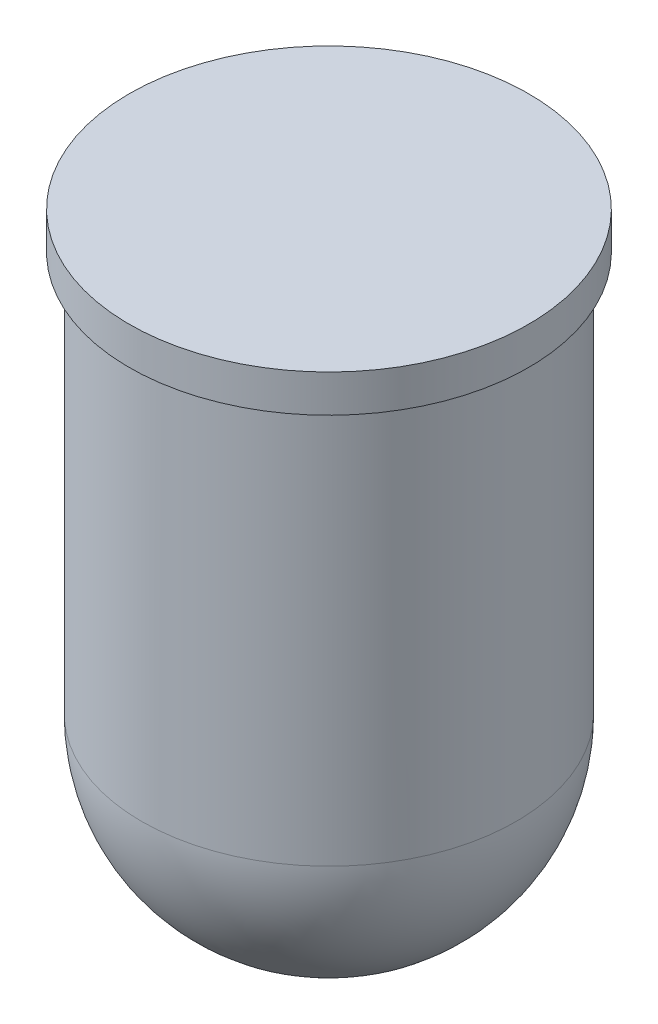
ISO-10303-21;
HEADER;
FILE_DESCRIPTION(('STEP AP214'),'2;1');
FILE_NAME('part.step','',(''),(''),'','','');
FILE_SCHEMA(('AUTOMOTIVE_DESIGN { 1 0 10303 214 1 1 1 1 }'));
ENDSEC;
DATA;
#1=APPLICATION_CONTEXT('core data for automotive mechanical design processes');
#2=APPLICATION_PROTOCOL_DEFINITION('international standard','automotive_design',2000,#1);
#3=PRODUCT_CONTEXT('',#1,'mechanical');
#4=PRODUCT('Part','Part','',(#3));
#5=PRODUCT_RELATED_PRODUCT_CATEGORY('part','',(#4));
#6=PRODUCT_DEFINITION_FORMATION('','',#4);
#7=PRODUCT_DEFINITION_CONTEXT('part definition',#1,'design');
#8=PRODUCT_DEFINITION('design','',#6,#7);
#9=PRODUCT_DEFINITION_SHAPE('','',#8);
#10=(LENGTH_UNIT() NAMED_UNIT(*) SI_UNIT(.MILLI.,.METRE.));
#11=(NAMED_UNIT(*) PLANE_ANGLE_UNIT() SI_UNIT($,.RADIAN.));
#12=(NAMED_UNIT(*) SI_UNIT($,.STERADIAN.) SOLID_ANGLE_UNIT());
#13=UNCERTAINTY_MEASURE_WITH_UNIT(LENGTH_MEASURE(1.E-05),#10,'distance_accuracy_value','');
#14=(GEOMETRIC_REPRESENTATION_CONTEXT(3) GLOBAL_UNCERTAINTY_ASSIGNED_CONTEXT((#13)) GLOBAL_UNIT_ASSIGNED_CONTEXT((#10,
#11,#12)) REPRESENTATION_CONTEXT('',''));
#15=CARTESIAN_POINT('',(0.,0.,0.));
#16=DIRECTION('',(0.,0.,1.));
#17=DIRECTION('',(1.,0.,0.));
#18=AXIS2_PLACEMENT_3D('',#15,#16,#17);
#19=CARTESIAN_POINT('',(60.,5.,0.));
#20=DIRECTION('',(0.,1.,0.));
#21=DIRECTION('',(0.,0.,-1.));
#22=AXIS2_PLACEMENT_3D('',#19,#20,#21);
#23=PLANE('',#22);
#24=CARTESIAN_POINT('',(60.,5.,0.));
#25=DIRECTION('',(0.,1.,0.));
#26=DIRECTION('',(1.,0.,0.));
#27=AXIS2_PLACEMENT_3D('',#24,#25,#26);
#28=CIRCLE('',#27,1.6);
#29=CARTESIAN_POINT('',(58.4,5.,0.));
#30=VERTEX_POINT('',#29);
#31=EDGE_CURVE('E11',#30,#30,#28,.T.);
#32=ORIENTED_EDGE('',*,*,#31,.T.);
#33=EDGE_LOOP('',(#32));
#34=FACE_BOUND('',#33,.T.);
#35=ADVANCED_FACE('F16',(#34),#23,.T.);
#36=CARTESIAN_POINT('',(60.,4.85,0.));
#37=DIRECTION('',(0.,-1.,0.));
#38=DIRECTION('',(1.,0.,0.));
#39=AXIS2_PLACEMENT_3D('',#36,#37,#38);
#40=CYLINDRICAL_SURFACE('',#39,1.6);
#41=CARTESIAN_POINT('',(60.,4.7,0.));
#42=DIRECTION('',(0.,-1.,0.));
#43=DIRECTION('',(1.,0.,0.));
#44=AXIS2_PLACEMENT_3D('',#41,#42,#43);
#45=CIRCLE('',#44,1.6);
#46=CARTESIAN_POINT('',(58.4,4.7,0.));
#47=VERTEX_POINT('',#46);
#48=EDGE_CURVE('E65',#47,#47,#45,.T.);
#49=ORIENTED_EDGE('',*,*,#48,.F.);
#50=DIRECTION('',(0.,1.,0.));
#51=VECTOR('',#50,1.);
#52=CARTESIAN_POINT('',(58.4,4.85,0.));
#53=LINE('',#52,#51);
#54=EDGE_CURVE('E27',#47,#30,#53,.T.);
#55=ORIENTED_EDGE('',*,*,#54,.T.);
#56=ORIENTED_EDGE('',*,*,#31,.F.);
#57=ORIENTED_EDGE('',*,*,#54,.F.);
#58=EDGE_LOOP('',(#49,#55,#56,#57));
#59=FACE_BOUND('',#58,.T.);
#60=ADVANCED_FACE('F18',(#59),#40,.T.);
#61=CARTESIAN_POINT('',(60.,4.7,0.));
#62=DIRECTION('',(0.,-1.,0.));
#63=DIRECTION('',(-1.,0.,0.));
#64=AXIS2_PLACEMENT_3D('',#61,#62,#63);
#65=PLANE('',#64);
#66=CARTESIAN_POINT('',(60.,4.7,0.));
#67=DIRECTION('',(0.,-1.,0.));
#68=DIRECTION('',(1.,0.,0.));
#69=AXIS2_PLACEMENT_3D('',#66,#67,#68);
#70=CIRCLE('',#69,1.5);
#71=CARTESIAN_POINT('',(58.5,4.7,0.));
#72=VERTEX_POINT('',#71);
#73=EDGE_CURVE('E63',#72,#72,#70,.T.);
#74=ORIENTED_EDGE('',*,*,#73,.F.);
#75=EDGE_LOOP('',(#74));
#76=FACE_BOUND('',#75,.T.);
#77=ORIENTED_EDGE('',*,*,#48,.T.);
#78=EDGE_LOOP('',(#77));
#79=FACE_BOUND('',#78,.T.);
#80=ADVANCED_FACE('F91',(#76,#79),#65,.T.);
#81=CARTESIAN_POINT('',(60.,2.5,0.));
#82=DIRECTION('',(0.,1.,0.));
#83=DIRECTION('',(1.,0.,0.));
#84=AXIS2_PLACEMENT_3D('',#81,#82,#83);
#85=CYLINDRICAL_SURFACE('',#84,1.5);
#86=ORIENTED_EDGE('',*,*,#73,.T.);
#87=DIRECTION('',(0.,-1.,0.));
#88=VECTOR('',#87,1.);
#89=CARTESIAN_POINT('',(58.5,2.5,0.));
#90=LINE('',#89,#88);
#91=CARTESIAN_POINT('',(58.5,1.5,0.));
#92=VERTEX_POINT('',#91);
#93=EDGE_CURVE('E60',#72,#92,#90,.T.);
#94=ORIENTED_EDGE('',*,*,#93,.T.);
#95=CARTESIAN_POINT('',(60.,1.5,0.));
#96=DIRECTION('',(0.,-1.,0.));
#97=DIRECTION('',(1.,0.,0.));
#98=AXIS2_PLACEMENT_3D('',#95,#96,#97);
#99=CIRCLE('',#98,1.5);
#100=CARTESIAN_POINT('',(60.,1.5,1.5));
#101=VERTEX_POINT('',#100);
#102=EDGE_CURVE('E53',#101,#92,#99,.T.);
#103=ORIENTED_EDGE('',*,*,#102,.F.);
#104=CARTESIAN_POINT('',(60.,1.5,0.));
#105=DIRECTION('',(0.,-1.,0.));
#106=DIRECTION('',(1.,0.,0.));
#107=AXIS2_PLACEMENT_3D('',#104,#105,#106);
#108=CIRCLE('',#107,1.5);
#109=EDGE_CURVE('E70',#92,#101,#108,.T.);
#110=ORIENTED_EDGE('',*,*,#109,.F.);
#111=ORIENTED_EDGE('',*,*,#93,.F.);
#112=EDGE_LOOP('',(#86,#94,#103,#110,#111));
#113=FACE_BOUND('',#112,.T.);
#114=ADVANCED_FACE('F61',(#113),#85,.T.);
#115=CARTESIAN_POINT('',(60.,1.5,0.));
#116=DIRECTION('',(0.,1.,0.));
#117=DIRECTION('',(0.,0.,-1.));
#118=AXIS2_PLACEMENT_3D('',#115,#116,#117);
#119=SPHERICAL_SURFACE('',#118,1.5);
#120=ORIENTED_EDGE('',*,*,#109,.T.);
#121=CARTESIAN_POINT('',(60.,1.5,0.));
#122=DIRECTION('',(1.,0.,0.));
#123=DIRECTION('',(0.,0.,1.));
#124=AXIS2_PLACEMENT_3D('',#121,#122,#123);
#125=CIRCLE('',#124,1.5);
#126=CARTESIAN_POINT('',(60.,0.,0.));
#127=VERTEX_POINT('',#126);
#128=EDGE_CURVE('E20',#101,#127,#125,.T.);
#129=ORIENTED_EDGE('',*,*,#128,.T.);
#130=ORIENTED_EDGE('',*,*,#128,.F.);
#131=ORIENTED_EDGE('',*,*,#102,.T.);
#132=EDGE_LOOP('',(#120,#129,#130,#131));
#133=FACE_BOUND('',#132,.T.);
#134=ADVANCED_FACE('F69',(#133),#119,.T.);
#135=CLOSED_SHELL('',(#35,#60,#80,#114,#134));
#136=MANIFOLD_SOLID_BREP('B1',#135);
#137=ADVANCED_BREP_SHAPE_REPRESENTATION('',(#18,#136),#14);
#138=SHAPE_DEFINITION_REPRESENTATION(#9,#137);
ENDSEC;
END-ISO-10303-21;
